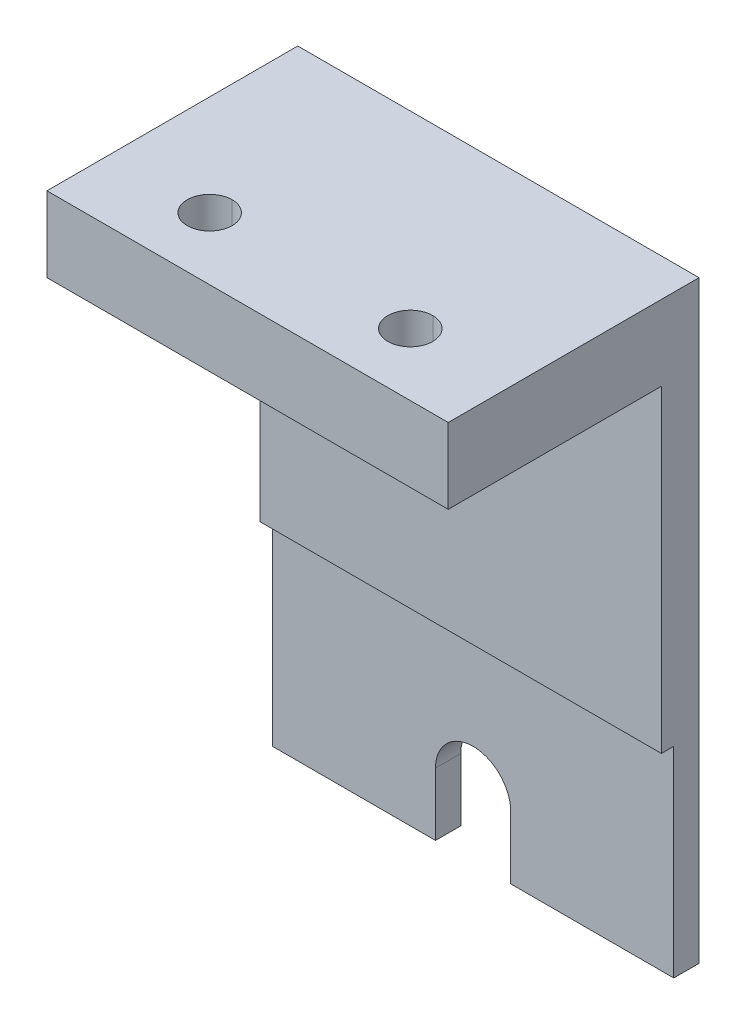
ISO-10303-21;
HEADER;
FILE_DESCRIPTION(('STEP AP214'),'2;1');
FILE_NAME('part.step','',(''),(''),'','','');
FILE_SCHEMA(('AUTOMOTIVE_DESIGN { 1 0 10303 214 1 1 1 1 }'));
ENDSEC;
DATA;
#1=APPLICATION_CONTEXT('core data for automotive mechanical design processes');
#2=APPLICATION_PROTOCOL_DEFINITION('international standard','automotive_design',2000,#1);
#3=PRODUCT_CONTEXT('',#1,'mechanical');
#4=PRODUCT('Part','Part','',(#3));
#5=PRODUCT_RELATED_PRODUCT_CATEGORY('part','',(#4));
#6=PRODUCT_DEFINITION_FORMATION('','',#4);
#7=PRODUCT_DEFINITION_CONTEXT('part definition',#1,'design');
#8=PRODUCT_DEFINITION('design','',#6,#7);
#9=PRODUCT_DEFINITION_SHAPE('','',#8);
#10=(LENGTH_UNIT() NAMED_UNIT(*) SI_UNIT(.MILLI.,.METRE.));
#11=(NAMED_UNIT(*) PLANE_ANGLE_UNIT() SI_UNIT($,.RADIAN.));
#12=(NAMED_UNIT(*) SI_UNIT($,.STERADIAN.) SOLID_ANGLE_UNIT());
#13=UNCERTAINTY_MEASURE_WITH_UNIT(LENGTH_MEASURE(1.E-05),#10,'distance_accuracy_value','');
#14=(GEOMETRIC_REPRESENTATION_CONTEXT(3) GLOBAL_UNCERTAINTY_ASSIGNED_CONTEXT((#13)) GLOBAL_UNIT_ASSIGNED_CONTEXT((#10,
#11,#12)) REPRESENTATION_CONTEXT('',''));
#15=CARTESIAN_POINT('',(0.,0.,0.));
#16=DIRECTION('',(0.,0.,1.));
#17=DIRECTION('',(1.,0.,0.));
#18=AXIS2_PLACEMENT_3D('',#15,#16,#17);
#19=CARTESIAN_POINT('',(0.,-53.18125,15.875));
#20=DIRECTION('',(0.,0.,-1.));
#21=DIRECTION('',(0.,1.,0.));
#22=AXIS2_PLACEMENT_3D('',#19,#20,#21);
#23=CYLINDRICAL_SURFACE('',#22,2.38125);
#24=CARTESIAN_POINT('',(0.,-53.18125,1.6002));
#25=DIRECTION('',(0.,0.,-1.));
#26=DIRECTION('',(-1.,0.,0.));
#27=AXIS2_PLACEMENT_3D('',#24,#25,#26);
#28=CIRCLE('',#27,2.38125);
#29=CARTESIAN_POINT('',(0.,-50.8,1.6002));
#30=VERTEX_POINT('',#29);
#31=CARTESIAN_POINT('',(2.38125,-53.18125,1.6002));
#32=VERTEX_POINT('',#31);
#33=EDGE_CURVE('E41',#30,#32,#28,.T.);
#34=ORIENTED_EDGE('',*,*,#33,.F.);
#35=DIRECTION('',(0.,0.,-1.));
#36=VECTOR('',#35,1.);
#37=CARTESIAN_POINT('',(0.,-50.8,15.875));
#38=LINE('',#37,#36);
#39=CARTESIAN_POINT('',(0.,-50.8,0.));
#40=VERTEX_POINT('',#39);
#41=EDGE_CURVE('E11',#30,#40,#38,.T.);
#42=ORIENTED_EDGE('',*,*,#41,.T.);
#43=CARTESIAN_POINT('',(0.,-53.18125,0.));
#44=DIRECTION('',(0.,0.,-1.));
#45=DIRECTION('',(0.,-1.,0.));
#46=AXIS2_PLACEMENT_3D('',#43,#44,#45);
#47=CIRCLE('',#46,2.38125);
#48=CARTESIAN_POINT('',(2.38125,-53.18125,0.));
#49=VERTEX_POINT('',#48);
#50=EDGE_CURVE('E28',#40,#49,#47,.T.);
#51=ORIENTED_EDGE('',*,*,#50,.T.);
#52=DIRECTION('',(0.,0.,-1.));
#53=VECTOR('',#52,1.);
#54=CARTESIAN_POINT('',(2.38125,-53.18125,15.875));
#55=LINE('',#54,#53);
#56=EDGE_CURVE('E263',#32,#49,#55,.T.);
#57=ORIENTED_EDGE('',*,*,#56,.F.);
#58=EDGE_LOOP('',(#34,#42,#51,#57));
#59=FACE_BOUND('',#58,.T.);
#60=ADVANCED_FACE('F17',(#59),#23,.F.);
#61=CARTESIAN_POINT('',(-6.35,0.,11.9253));
#62=DIRECTION('',(0.,1.,0.));
#63=DIRECTION('',(0.,0.,1.));
#64=AXIS2_PLACEMENT_3D('',#61,#62,#63);
#65=CYLINDRICAL_SURFACE('',#64,1.4224);
#66=CARTESIAN_POINT('',(-6.35,-24.3205,11.9253));
#67=DIRECTION('',(0.,1.,0.));
#68=DIRECTION('',(0.,0.,1.));
#69=AXIS2_PLACEMENT_3D('',#66,#67,#68);
#70=CIRCLE('',#69,1.4224);
#71=CARTESIAN_POINT('',(-6.35,-24.3205,10.5029));
#72=VERTEX_POINT('',#71);
#73=CARTESIAN_POINT('',(-6.35,-24.3205,13.3477));
#74=VERTEX_POINT('',#73);
#75=EDGE_CURVE('E352',#72,#74,#70,.T.);
#76=ORIENTED_EDGE('',*,*,#75,.F.);
#77=DIRECTION('',(0.,1.,0.));
#78=VECTOR('',#77,1.);
#79=CARTESIAN_POINT('',(-6.35,0.,10.5029));
#80=LINE('',#79,#78);
#81=CARTESIAN_POINT('',(-6.35,-19.558,10.5029));
#82=VERTEX_POINT('',#81);
#83=EDGE_CURVE('E227',#72,#82,#80,.T.);
#84=ORIENTED_EDGE('',*,*,#83,.T.);
#85=CARTESIAN_POINT('',(-6.35,-19.558,11.9253));
#86=DIRECTION('',(0.,1.,0.));
#87=DIRECTION('',(0.,0.,1.));
#88=AXIS2_PLACEMENT_3D('',#85,#86,#87);
#89=CIRCLE('',#88,1.42239999999999);
#90=CARTESIAN_POINT('',(-6.35,-19.558,13.3477));
#91=VERTEX_POINT('',#90);
#92=EDGE_CURVE('E231',#82,#91,#89,.T.);
#93=ORIENTED_EDGE('',*,*,#92,.T.);
#94=DIRECTION('',(0.,1.,0.));
#95=VECTOR('',#94,1.);
#96=CARTESIAN_POINT('',(-6.35,0.,13.3477));
#97=LINE('',#96,#95);
#98=EDGE_CURVE('E282',#74,#91,#97,.T.);
#99=ORIENTED_EDGE('',*,*,#98,.F.);
#100=EDGE_LOOP('',(#76,#84,#93,#99));
#101=FACE_BOUND('',#100,.T.);
#102=ADVANCED_FACE('F387',(#101),#65,.F.);
#103=CARTESIAN_POINT('',(6.35,0.,11.9253));
#104=DIRECTION('',(0.,1.,0.));
#105=DIRECTION('',(0.,0.,1.));
#106=AXIS2_PLACEMENT_3D('',#103,#104,#105);
#107=CYLINDRICAL_SURFACE('',#106,1.4224);
#108=CARTESIAN_POINT('',(6.35,-24.3205,11.9253));
#109=DIRECTION('',(0.,1.,0.));
#110=DIRECTION('',(0.,0.,1.));
#111=AXIS2_PLACEMENT_3D('',#108,#109,#110);
#112=CIRCLE('',#111,1.4224);
#113=CARTESIAN_POINT('',(6.35,-24.3205,10.5029));
#114=VERTEX_POINT('',#113);
#115=CARTESIAN_POINT('',(6.35,-24.3205,13.3477));
#116=VERTEX_POINT('',#115);
#117=EDGE_CURVE('E21',#114,#116,#112,.T.);
#118=ORIENTED_EDGE('',*,*,#117,.F.);
#119=DIRECTION('',(0.,1.,0.));
#120=VECTOR('',#119,1.);
#121=CARTESIAN_POINT('',(6.35,0.,10.5029));
#122=LINE('',#121,#120);
#123=CARTESIAN_POINT('',(6.35,-19.558,10.5029));
#124=VERTEX_POINT('',#123);
#125=EDGE_CURVE('E308',#114,#124,#122,.T.);
#126=ORIENTED_EDGE('',*,*,#125,.T.);
#127=CARTESIAN_POINT('',(6.35,-19.558,11.9253));
#128=DIRECTION('',(0.,1.,0.));
#129=DIRECTION('',(0.,0.,1.));
#130=AXIS2_PLACEMENT_3D('',#127,#128,#129);
#131=CIRCLE('',#130,1.42239999999999);
#132=CARTESIAN_POINT('',(6.35,-19.558,13.3477));
#133=VERTEX_POINT('',#132);
#134=EDGE_CURVE('E298',#124,#133,#131,.T.);
#135=ORIENTED_EDGE('',*,*,#134,.T.);
#136=DIRECTION('',(0.,1.,0.));
#137=VECTOR('',#136,1.);
#138=CARTESIAN_POINT('',(6.35,0.,13.3477));
#139=LINE('',#138,#137);
#140=EDGE_CURVE('E147',#116,#133,#139,.T.);
#141=ORIENTED_EDGE('',*,*,#140,.F.);
#142=EDGE_LOOP('',(#118,#126,#135,#141));
#143=FACE_BOUND('',#142,.T.);
#144=ADVANCED_FACE('F365',(#143),#107,.F.);
#145=CARTESIAN_POINT('',(12.7,-57.15,0.));
#146=DIRECTION('',(0.,1.,0.));
#147=DIRECTION('',(1.,0.,0.));
#148=AXIS2_PLACEMENT_3D('',#145,#146,#147);
#149=PLANE('',#148);
#150=DIRECTION('',(1.,0.,0.));
#151=VECTOR('',#150,1.);
#152=CARTESIAN_POINT('',(-12.7,-57.15,1.6002));
#153=LINE('',#152,#151);
#154=CARTESIAN_POINT('',(2.38125,-57.15,1.6002));
#155=VERTEX_POINT('',#154);
#156=CARTESIAN_POINT('',(12.7,-57.15,1.6002));
#157=VERTEX_POINT('',#156);
#158=EDGE_CURVE('E158',#155,#157,#153,.T.);
#159=ORIENTED_EDGE('',*,*,#158,.F.);
#160=DIRECTION('',(0.,0.,-1.));
#161=VECTOR('',#160,1.);
#162=CARTESIAN_POINT('',(2.38125,-57.15,15.875));
#163=LINE('',#162,#161);
#164=CARTESIAN_POINT('',(2.38125,-57.15,0.));
#165=VERTEX_POINT('',#164);
#166=EDGE_CURVE('E235',#155,#165,#163,.T.);
#167=ORIENTED_EDGE('',*,*,#166,.T.);
#168=DIRECTION('',(-1.,0.,0.));
#169=VECTOR('',#168,1.);
#170=CARTESIAN_POINT('',(12.7,-57.15,0.));
#171=LINE('',#170,#169);
#172=CARTESIAN_POINT('',(12.7,-57.15,0.));
#173=VERTEX_POINT('',#172);
#174=EDGE_CURVE('E232',#173,#165,#171,.T.);
#175=ORIENTED_EDGE('',*,*,#174,.F.);
#176=DIRECTION('',(0.,0.,-1.));
#177=VECTOR('',#176,1.);
#178=CARTESIAN_POINT('',(12.7,-57.15,0.));
#179=LINE('',#178,#177);
#180=EDGE_CURVE('E252',#157,#173,#179,.T.);
#181=ORIENTED_EDGE('',*,*,#180,.F.);
#182=EDGE_LOOP('',(#159,#167,#175,#181));
#183=FACE_BOUND('',#182,.T.);
#184=ADVANCED_FACE('F381',(#183),#149,.F.);
#185=CARTESIAN_POINT('',(12.7,0.,0.));
#186=DIRECTION('',(0.,0.,1.));
#187=DIRECTION('',(0.,-1.,0.));
#188=AXIS2_PLACEMENT_3D('',#185,#186,#187);
#189=PLANE('',#188);
#190=ORIENTED_EDGE('',*,*,#174,.T.);
#191=DIRECTION('',(0.,-1.,0.));
#192=VECTOR('',#191,1.);
#193=CARTESIAN_POINT('',(2.38125,-57.15,0.));
#194=LINE('',#193,#192);
#195=EDGE_CURVE('E215',#49,#165,#194,.T.);
#196=ORIENTED_EDGE('',*,*,#195,.F.);
#197=ORIENTED_EDGE('',*,*,#50,.F.);
#198=CARTESIAN_POINT('',(0.,-53.18125,0.));
#199=DIRECTION('',(0.,0.,-1.));
#200=DIRECTION('',(0.,-1.,0.));
#201=AXIS2_PLACEMENT_3D('',#198,#199,#200);
#202=CIRCLE('',#201,2.38125);
#203=CARTESIAN_POINT('',(-2.38125,-53.18125,0.));
#204=VERTEX_POINT('',#203);
#205=EDGE_CURVE('E216',#204,#40,#202,.T.);
#206=ORIENTED_EDGE('',*,*,#205,.F.);
#207=DIRECTION('',(0.,1.,0.));
#208=VECTOR('',#207,1.);
#209=CARTESIAN_POINT('',(-2.38125,-57.15,0.));
#210=LINE('',#209,#208);
#211=CARTESIAN_POINT('',(-2.38125,-57.15,0.));
#212=VERTEX_POINT('',#211);
#213=EDGE_CURVE('E259',#212,#204,#210,.T.);
#214=ORIENTED_EDGE('',*,*,#213,.F.);
#215=DIRECTION('',(-1.,0.,0.));
#216=VECTOR('',#215,1.);
#217=CARTESIAN_POINT('',(12.7,-57.15,0.));
#218=LINE('',#217,#216);
#219=CARTESIAN_POINT('',(-12.7,-57.15,0.));
#220=VERTEX_POINT('',#219);
#221=EDGE_CURVE('E236',#212,#220,#218,.T.);
#222=ORIENTED_EDGE('',*,*,#221,.T.);
#223=DIRECTION('',(0.,1.,0.));
#224=VECTOR('',#223,1.);
#225=CARTESIAN_POINT('',(-12.7,0.,0.));
#226=LINE('',#225,#224);
#227=CARTESIAN_POINT('',(-12.7,-19.558,0.));
#228=VERTEX_POINT('',#227);
#229=EDGE_CURVE('E248',#220,#228,#226,.T.);
#230=ORIENTED_EDGE('',*,*,#229,.T.);
#231=DIRECTION('',(-1.,0.,0.));
#232=VECTOR('',#231,1.);
#233=CARTESIAN_POINT('',(12.7,-19.558,0.));
#234=LINE('',#233,#232);
#235=CARTESIAN_POINT('',(12.7,-19.558,0.));
#236=VERTEX_POINT('',#235);
#237=EDGE_CURVE('E316',#236,#228,#234,.T.);
#238=ORIENTED_EDGE('',*,*,#237,.F.);
#239=DIRECTION('',(0.,1.,0.));
#240=VECTOR('',#239,1.);
#241=CARTESIAN_POINT('',(12.7,0.,0.));
#242=LINE('',#241,#240);
#243=EDGE_CURVE('E249',#173,#236,#242,.T.);
#244=ORIENTED_EDGE('',*,*,#243,.F.);
#245=EDGE_LOOP('',(#190,#196,#197,#206,#214,#222,#230,#238,#244));
#246=FACE_BOUND('',#245,.T.);
#247=ADVANCED_FACE('F370',(#246),#189,.F.);
#248=CARTESIAN_POINT('',(12.7,-19.558,0.));
#249=DIRECTION('',(0.,-1.,0.));
#250=DIRECTION('',(0.,0.,-1.));
#251=AXIS2_PLACEMENT_3D('',#248,#249,#250);
#252=PLANE('',#251);
#253=DIRECTION('',(0.,0.,1.));
#254=VECTOR('',#253,1.);
#255=CARTESIAN_POINT('',(-12.7,-19.558,0.));
#256=LINE('',#255,#254);
#257=CARTESIAN_POINT('',(-12.7,-19.558,15.875));
#258=VERTEX_POINT('',#257);
#259=EDGE_CURVE('E270',#228,#258,#256,.T.);
#260=ORIENTED_EDGE('',*,*,#259,.T.);
#261=DIRECTION('',(-1.,0.,0.));
#262=VECTOR('',#261,1.);
#263=CARTESIAN_POINT('',(12.7,-19.558,15.875));
#264=LINE('',#263,#262);
#265=CARTESIAN_POINT('',(12.7,-19.558,15.875));
#266=VERTEX_POINT('',#265);
#267=EDGE_CURVE('E292',#266,#258,#264,.T.);
#268=ORIENTED_EDGE('',*,*,#267,.F.);
#269=DIRECTION('',(0.,0.,1.));
#270=VECTOR('',#269,1.);
#271=CARTESIAN_POINT('',(12.7,-19.558,0.));
#272=LINE('',#271,#270);
#273=EDGE_CURVE('E239',#236,#266,#272,.T.);
#274=ORIENTED_EDGE('',*,*,#273,.F.);
#275=ORIENTED_EDGE('',*,*,#237,.T.);
#276=EDGE_LOOP('',(#260,#268,#274,#275));
#277=FACE_BOUND('',#276,.T.);
#278=CARTESIAN_POINT('',(-6.35,-19.558,11.9253));
#279=DIRECTION('',(0.,1.,0.));
#280=DIRECTION('',(0.,0.,1.));
#281=AXIS2_PLACEMENT_3D('',#278,#279,#280);
#282=CIRCLE('',#281,1.42239999999999);
#283=EDGE_CURVE('E266',#91,#82,#282,.T.);
#284=ORIENTED_EDGE('',*,*,#283,.F.);
#285=ORIENTED_EDGE('',*,*,#92,.F.);
#286=EDGE_LOOP('',(#284,#285));
#287=FACE_BOUND('',#286,.T.);
#288=CARTESIAN_POINT('',(6.35,-19.558,11.9253));
#289=DIRECTION('',(0.,1.,0.));
#290=DIRECTION('',(0.,0.,1.));
#291=AXIS2_PLACEMENT_3D('',#288,#289,#290);
#292=CIRCLE('',#291,1.42239999999999);
#293=EDGE_CURVE('E273',#133,#124,#292,.T.);
#294=ORIENTED_EDGE('',*,*,#293,.F.);
#295=ORIENTED_EDGE('',*,*,#134,.F.);
#296=EDGE_LOOP('',(#294,#295));
#297=FACE_BOUND('',#296,.T.);
#298=ADVANCED_FACE('F367',(#277,#287,#297),#252,.F.);
#299=CARTESIAN_POINT('',(12.7,0.,15.875));
#300=DIRECTION('',(0.,0.,-1.));
#301=DIRECTION('',(-1.,0.,0.));
#302=AXIS2_PLACEMENT_3D('',#299,#300,#301);
#303=PLANE('',#302);
#304=DIRECTION('',(0.,-1.,0.));
#305=VECTOR('',#304,1.);
#306=CARTESIAN_POINT('',(-12.7,0.,15.875));
#307=LINE('',#306,#305);
#308=CARTESIAN_POINT('',(-12.7,-24.3205,15.875));
#309=VERTEX_POINT('',#308);
#310=EDGE_CURVE('E312',#258,#309,#307,.T.);
#311=ORIENTED_EDGE('',*,*,#310,.T.);
#312=DIRECTION('',(1.,0.,0.));
#313=VECTOR('',#312,1.);
#314=CARTESIAN_POINT('',(-12.7,-24.3205,15.875));
#315=LINE('',#314,#313);
#316=CARTESIAN_POINT('',(12.7,-24.3205,15.875));
#317=VERTEX_POINT('',#316);
#318=EDGE_CURVE('E317',#309,#317,#315,.T.);
#319=ORIENTED_EDGE('',*,*,#318,.T.);
#320=DIRECTION('',(0.,-1.,0.));
#321=VECTOR('',#320,1.);
#322=CARTESIAN_POINT('',(12.7,0.,15.875));
#323=LINE('',#322,#321);
#324=EDGE_CURVE('E191',#266,#317,#323,.T.);
#325=ORIENTED_EDGE('',*,*,#324,.F.);
#326=ORIENTED_EDGE('',*,*,#267,.T.);
#327=EDGE_LOOP('',(#311,#319,#325,#326));
#328=FACE_BOUND('',#327,.T.);
#329=ADVANCED_FACE('F369',(#328),#303,.F.);
#330=CARTESIAN_POINT('',(12.7,-57.15,0.));
#331=DIRECTION('',(0.,1.,0.));
#332=DIRECTION('',(1.,0.,0.));
#333=AXIS2_PLACEMENT_3D('',#330,#331,#332);
#334=PLANE('',#333);
#335=ORIENTED_EDGE('',*,*,#221,.F.);
#336=DIRECTION('',(0.,0.,-1.));
#337=VECTOR('',#336,1.);
#338=CARTESIAN_POINT('',(-2.38125,-57.15,15.875));
#339=LINE('',#338,#337);
#340=CARTESIAN_POINT('',(-2.38125,-57.15,1.6002));
#341=VERTEX_POINT('',#340);
#342=EDGE_CURVE('E220',#341,#212,#339,.T.);
#343=ORIENTED_EDGE('',*,*,#342,.F.);
#344=DIRECTION('',(1.,0.,0.));
#345=VECTOR('',#344,1.);
#346=CARTESIAN_POINT('',(-12.7,-57.15,1.6002));
#347=LINE('',#346,#345);
#348=CARTESIAN_POINT('',(-12.7,-57.15,1.6002));
#349=VERTEX_POINT('',#348);
#350=EDGE_CURVE('E240',#349,#341,#347,.T.);
#351=ORIENTED_EDGE('',*,*,#350,.F.);
#352=DIRECTION('',(0.,0.,-1.));
#353=VECTOR('',#352,1.);
#354=CARTESIAN_POINT('',(-12.7,-57.15,0.));
#355=LINE('',#354,#353);
#356=EDGE_CURVE('E288',#349,#220,#355,.T.);
#357=ORIENTED_EDGE('',*,*,#356,.T.);
#358=EDGE_LOOP('',(#335,#343,#351,#357));
#359=FACE_BOUND('',#358,.T.);
#360=ADVANCED_FACE('F378',(#359),#334,.F.);
#361=CARTESIAN_POINT('',(12.7,0.,0.));
#362=DIRECTION('',(-1.,0.,0.));
#363=DIRECTION('',(0.,0.,1.));
#364=AXIS2_PLACEMENT_3D('',#361,#362,#363);
#365=PLANE('',#364);
#366=DIRECTION('',(0.,1.,0.));
#367=VECTOR('',#366,1.);
#368=CARTESIAN_POINT('',(12.7,-57.15,2.38125));
#369=LINE('',#368,#367);
#370=CARTESIAN_POINT('',(12.7,-44.45,2.38125));
#371=VERTEX_POINT('',#370);
#372=CARTESIAN_POINT('',(12.7,-24.3205,2.38125));
#373=VERTEX_POINT('',#372);
#374=EDGE_CURVE('E199',#371,#373,#369,.T.);
#375=ORIENTED_EDGE('',*,*,#374,.F.);
#376=DIRECTION('',(0.,0.,1.));
#377=VECTOR('',#376,1.);
#378=CARTESIAN_POINT('',(12.7,-44.45,2.38125));
#379=LINE('',#378,#377);
#380=CARTESIAN_POINT('',(12.7,-44.45,1.6002));
#381=VERTEX_POINT('',#380);
#382=EDGE_CURVE('E196',#381,#371,#379,.T.);
#383=ORIENTED_EDGE('',*,*,#382,.F.);
#384=DIRECTION('',(0.,1.,0.));
#385=VECTOR('',#384,1.);
#386=CARTESIAN_POINT('',(12.7,-57.15,1.6002));
#387=LINE('',#386,#385);
#388=EDGE_CURVE('E210',#157,#381,#387,.T.);
#389=ORIENTED_EDGE('',*,*,#388,.F.);
#390=ORIENTED_EDGE('',*,*,#180,.T.);
#391=ORIENTED_EDGE('',*,*,#243,.T.);
#392=ORIENTED_EDGE('',*,*,#273,.T.);
#393=ORIENTED_EDGE('',*,*,#324,.T.);
#394=DIRECTION('',(0.,0.,1.));
#395=VECTOR('',#394,1.);
#396=CARTESIAN_POINT('',(12.7,-24.3205,15.875));
#397=LINE('',#396,#395);
#398=EDGE_CURVE('E258',#373,#317,#397,.T.);
#399=ORIENTED_EDGE('',*,*,#398,.F.);
#400=EDGE_LOOP('',(#375,#383,#389,#390,#391,#392,#393,#399));
#401=FACE_BOUND('',#400,.T.);
#402=ADVANCED_FACE('F400',(#401),#365,.F.);
#403=CARTESIAN_POINT('',(-12.7,0.,0.));
#404=DIRECTION('',(-1.,0.,0.));
#405=DIRECTION('',(0.,0.,1.));
#406=AXIS2_PLACEMENT_3D('',#403,#404,#405);
#407=PLANE('',#406);
#408=DIRECTION('',(0.,0.,1.));
#409=VECTOR('',#408,1.);
#410=CARTESIAN_POINT('',(-12.7,-44.45,2.38125));
#411=LINE('',#410,#409);
#412=CARTESIAN_POINT('',(-12.7,-44.45,1.6002));
#413=VERTEX_POINT('',#412);
#414=CARTESIAN_POINT('',(-12.7,-44.45,2.38125));
#415=VERTEX_POINT('',#414);
#416=EDGE_CURVE('E179',#413,#415,#411,.T.);
#417=ORIENTED_EDGE('',*,*,#416,.T.);
#418=DIRECTION('',(0.,1.,0.));
#419=VECTOR('',#418,1.);
#420=CARTESIAN_POINT('',(-12.7,-57.15,2.38125));
#421=LINE('',#420,#419);
#422=CARTESIAN_POINT('',(-12.7,-24.3205,2.38125));
#423=VERTEX_POINT('',#422);
#424=EDGE_CURVE('E168',#415,#423,#421,.T.);
#425=ORIENTED_EDGE('',*,*,#424,.T.);
#426=DIRECTION('',(0.,0.,1.));
#427=VECTOR('',#426,1.);
#428=CARTESIAN_POINT('',(-12.7,-24.3205,15.875));
#429=LINE('',#428,#427);
#430=EDGE_CURVE('E180',#423,#309,#429,.T.);
#431=ORIENTED_EDGE('',*,*,#430,.T.);
#432=ORIENTED_EDGE('',*,*,#310,.F.);
#433=ORIENTED_EDGE('',*,*,#259,.F.);
#434=ORIENTED_EDGE('',*,*,#229,.F.);
#435=ORIENTED_EDGE('',*,*,#356,.F.);
#436=DIRECTION('',(0.,1.,0.));
#437=VECTOR('',#436,1.);
#438=CARTESIAN_POINT('',(-12.7,-57.15,1.6002));
#439=LINE('',#438,#437);
#440=EDGE_CURVE('E186',#349,#413,#439,.T.);
#441=ORIENTED_EDGE('',*,*,#440,.T.);
#442=EDGE_LOOP('',(#417,#425,#431,#432,#433,#434,#435,#441));
#443=FACE_BOUND('',#442,.T.);
#444=ADVANCED_FACE('F183',(#443),#407,.T.);
#445=CARTESIAN_POINT('',(-12.7,-24.3205,15.875));
#446=DIRECTION('',(0.,1.,0.));
#447=DIRECTION('',(1.,0.,0.));
#448=AXIS2_PLACEMENT_3D('',#445,#446,#447);
#449=PLANE('',#448);
#450=ORIENTED_EDGE('',*,*,#398,.T.);
#451=ORIENTED_EDGE('',*,*,#318,.F.);
#452=ORIENTED_EDGE('',*,*,#430,.F.);
#453=DIRECTION('',(1.,0.,0.));
#454=VECTOR('',#453,1.);
#455=CARTESIAN_POINT('',(-12.7,-24.3205,2.38125));
#456=LINE('',#455,#454);
#457=EDGE_CURVE('E175',#423,#373,#456,.T.);
#458=ORIENTED_EDGE('',*,*,#457,.T.);
#459=EDGE_LOOP('',(#450,#451,#452,#458));
#460=FACE_BOUND('',#459,.T.);
#461=CARTESIAN_POINT('',(-6.35,-24.3205,11.9253));
#462=DIRECTION('',(0.,1.,0.));
#463=DIRECTION('',(0.,0.,1.));
#464=AXIS2_PLACEMENT_3D('',#461,#462,#463);
#465=CIRCLE('',#464,1.4224);
#466=EDGE_CURVE('E343',#74,#72,#465,.T.);
#467=ORIENTED_EDGE('',*,*,#466,.T.);
#468=ORIENTED_EDGE('',*,*,#75,.T.);
#469=EDGE_LOOP('',(#467,#468));
#470=FACE_BOUND('',#469,.T.);
#471=CARTESIAN_POINT('',(6.35,-24.3205,11.9253));
#472=DIRECTION('',(0.,1.,0.));
#473=DIRECTION('',(0.,0.,1.));
#474=AXIS2_PLACEMENT_3D('',#471,#472,#473);
#475=CIRCLE('',#474,1.4224);
#476=EDGE_CURVE('E204',#116,#114,#475,.T.);
#477=ORIENTED_EDGE('',*,*,#476,.T.);
#478=ORIENTED_EDGE('',*,*,#117,.T.);
#479=EDGE_LOOP('',(#477,#478));
#480=FACE_BOUND('',#479,.T.);
#481=ADVANCED_FACE('F19',(#460,#470,#480),#449,.F.);
#482=CARTESIAN_POINT('',(-12.7,-57.15,2.38125));
#483=DIRECTION('',(0.,0.,-1.));
#484=DIRECTION('',(0.,-1.,0.));
#485=AXIS2_PLACEMENT_3D('',#482,#483,#484);
#486=PLANE('',#485);
#487=ORIENTED_EDGE('',*,*,#424,.F.);
#488=DIRECTION('',(1.,0.,0.));
#489=VECTOR('',#488,1.);
#490=CARTESIAN_POINT('',(-12.7,-44.45,2.38125));
#491=LINE('',#490,#489);
#492=EDGE_CURVE('E173',#415,#371,#491,.T.);
#493=ORIENTED_EDGE('',*,*,#492,.T.);
#494=ORIENTED_EDGE('',*,*,#374,.T.);
#495=ORIENTED_EDGE('',*,*,#457,.F.);
#496=EDGE_LOOP('',(#487,#493,#494,#495));
#497=FACE_BOUND('',#496,.T.);
#498=ADVANCED_FACE('F170',(#497),#486,.F.);
#499=CARTESIAN_POINT('',(-12.7,-44.45,2.38125));
#500=DIRECTION('',(0.,1.,0.));
#501=DIRECTION('',(1.,0.,0.));
#502=AXIS2_PLACEMENT_3D('',#499,#500,#501);
#503=PLANE('',#502);
#504=ORIENTED_EDGE('',*,*,#382,.T.);
#505=ORIENTED_EDGE('',*,*,#492,.F.);
#506=ORIENTED_EDGE('',*,*,#416,.F.);
#507=DIRECTION('',(1.,0.,0.));
#508=VECTOR('',#507,1.);
#509=CARTESIAN_POINT('',(-12.7,-44.45,1.6002));
#510=LINE('',#509,#508);
#511=EDGE_CURVE('E253',#413,#381,#510,.T.);
#512=ORIENTED_EDGE('',*,*,#511,.T.);
#513=EDGE_LOOP('',(#504,#505,#506,#512));
#514=FACE_BOUND('',#513,.T.);
#515=ADVANCED_FACE('F194',(#514),#503,.F.);
#516=CARTESIAN_POINT('',(-12.7,-57.15,1.6002));
#517=DIRECTION('',(0.,0.,-1.));
#518=DIRECTION('',(0.,-1.,0.));
#519=AXIS2_PLACEMENT_3D('',#516,#517,#518);
#520=PLANE('',#519);
#521=CARTESIAN_POINT('',(0.,-53.18125,1.6002));
#522=DIRECTION('',(0.,0.,-1.));
#523=DIRECTION('',(-1.,0.,0.));
#524=AXIS2_PLACEMENT_3D('',#521,#522,#523);
#525=CIRCLE('',#524,2.38125);
#526=CARTESIAN_POINT('',(-2.38125,-53.18125,1.6002));
#527=VERTEX_POINT('',#526);
#528=EDGE_CURVE('E226',#527,#30,#525,.T.);
#529=ORIENTED_EDGE('',*,*,#528,.T.);
#530=ORIENTED_EDGE('',*,*,#33,.T.);
#531=DIRECTION('',(0.,-1.,0.));
#532=VECTOR('',#531,1.);
#533=CARTESIAN_POINT('',(2.38125,-57.15,1.6002));
#534=LINE('',#533,#532);
#535=EDGE_CURVE('E209',#32,#155,#534,.T.);
#536=ORIENTED_EDGE('',*,*,#535,.T.);
#537=ORIENTED_EDGE('',*,*,#158,.T.);
#538=ORIENTED_EDGE('',*,*,#388,.T.);
#539=ORIENTED_EDGE('',*,*,#511,.F.);
#540=ORIENTED_EDGE('',*,*,#440,.F.);
#541=ORIENTED_EDGE('',*,*,#350,.T.);
#542=DIRECTION('',(0.,1.,0.));
#543=VECTOR('',#542,1.);
#544=CARTESIAN_POINT('',(-2.38125,-57.15,1.6002));
#545=LINE('',#544,#543);
#546=EDGE_CURVE('E243',#341,#527,#545,.T.);
#547=ORIENTED_EDGE('',*,*,#546,.T.);
#548=EDGE_LOOP('',(#529,#530,#536,#537,#538,#539,#540,#541,#547));
#549=FACE_BOUND('',#548,.T.);
#550=ADVANCED_FACE('F404',(#549),#520,.F.);
#551=CARTESIAN_POINT('',(6.35,0.,11.9253));
#552=DIRECTION('',(0.,1.,0.));
#553=DIRECTION('',(0.,0.,1.));
#554=AXIS2_PLACEMENT_3D('',#551,#552,#553);
#555=CYLINDRICAL_SURFACE('',#554,1.4224);
#556=ORIENTED_EDGE('',*,*,#125,.F.);
#557=ORIENTED_EDGE('',*,*,#476,.F.);
#558=ORIENTED_EDGE('',*,*,#140,.T.);
#559=ORIENTED_EDGE('',*,*,#293,.T.);
#560=EDGE_LOOP('',(#556,#557,#558,#559));
#561=FACE_BOUND('',#560,.T.);
#562=ADVANCED_FACE('F363',(#561),#555,.F.);
#563=CARTESIAN_POINT('',(-6.35,0.,11.9253));
#564=DIRECTION('',(0.,1.,0.));
#565=DIRECTION('',(0.,0.,1.));
#566=AXIS2_PLACEMENT_3D('',#563,#564,#565);
#567=CYLINDRICAL_SURFACE('',#566,1.4224);
#568=ORIENTED_EDGE('',*,*,#83,.F.);
#569=ORIENTED_EDGE('',*,*,#466,.F.);
#570=ORIENTED_EDGE('',*,*,#98,.T.);
#571=ORIENTED_EDGE('',*,*,#283,.T.);
#572=EDGE_LOOP('',(#568,#569,#570,#571));
#573=FACE_BOUND('',#572,.T.);
#574=ADVANCED_FACE('F417',(#573),#567,.F.);
#575=CARTESIAN_POINT('',(2.38125,-57.15,15.875));
#576=DIRECTION('',(1.,0.,0.));
#577=DIRECTION('',(0.,1.,0.));
#578=AXIS2_PLACEMENT_3D('',#575,#576,#577);
#579=PLANE('',#578);
#580=ORIENTED_EDGE('',*,*,#56,.T.);
#581=ORIENTED_EDGE('',*,*,#195,.T.);
#582=ORIENTED_EDGE('',*,*,#166,.F.);
#583=ORIENTED_EDGE('',*,*,#535,.F.);
#584=EDGE_LOOP('',(#580,#581,#582,#583));
#585=FACE_BOUND('',#584,.T.);
#586=ADVANCED_FACE('F412',(#585),#579,.F.);
#587=CARTESIAN_POINT('',(0.,-53.18125,15.875));
#588=DIRECTION('',(0.,0.,-1.));
#589=DIRECTION('',(0.,1.,0.));
#590=AXIS2_PLACEMENT_3D('',#587,#588,#589);
#591=CYLINDRICAL_SURFACE('',#590,2.38125);
#592=ORIENTED_EDGE('',*,*,#41,.F.);
#593=ORIENTED_EDGE('',*,*,#528,.F.);
#594=DIRECTION('',(0.,0.,-1.));
#595=VECTOR('',#594,1.);
#596=CARTESIAN_POINT('',(-2.38125,-53.18125,15.875));
#597=LINE('',#596,#595);
#598=EDGE_CURVE('E211',#527,#204,#597,.T.);
#599=ORIENTED_EDGE('',*,*,#598,.T.);
#600=ORIENTED_EDGE('',*,*,#205,.T.);
#601=EDGE_LOOP('',(#592,#593,#599,#600));
#602=FACE_BOUND('',#601,.T.);
#603=ADVANCED_FACE('F408',(#602),#591,.F.);
#604=CARTESIAN_POINT('',(-2.38125,-57.15,15.875));
#605=DIRECTION('',(-1.,0.,0.));
#606=DIRECTION('',(0.,0.,1.));
#607=AXIS2_PLACEMENT_3D('',#604,#605,#606);
#608=PLANE('',#607);
#609=ORIENTED_EDGE('',*,*,#342,.T.);
#610=ORIENTED_EDGE('',*,*,#213,.T.);
#611=ORIENTED_EDGE('',*,*,#598,.F.);
#612=ORIENTED_EDGE('',*,*,#546,.F.);
#613=EDGE_LOOP('',(#609,#610,#611,#612));
#614=FACE_BOUND('',#613,.T.);
#615=ADVANCED_FACE('F411',(#614),#608,.F.);
#616=CLOSED_SHELL('',(#60,#102,#144,#184,#247,#298,#329,#360,#402,#444,#481,#498,#515,#550,#562,
#574,#586,#603,#615));
#617=MANIFOLD_SOLID_BREP('B1',#616);
#618=ADVANCED_BREP_SHAPE_REPRESENTATION('',(#18,#617),#14);
#619=SHAPE_DEFINITION_REPRESENTATION(#9,#618);
ENDSEC;
END-ISO-10303-21;
